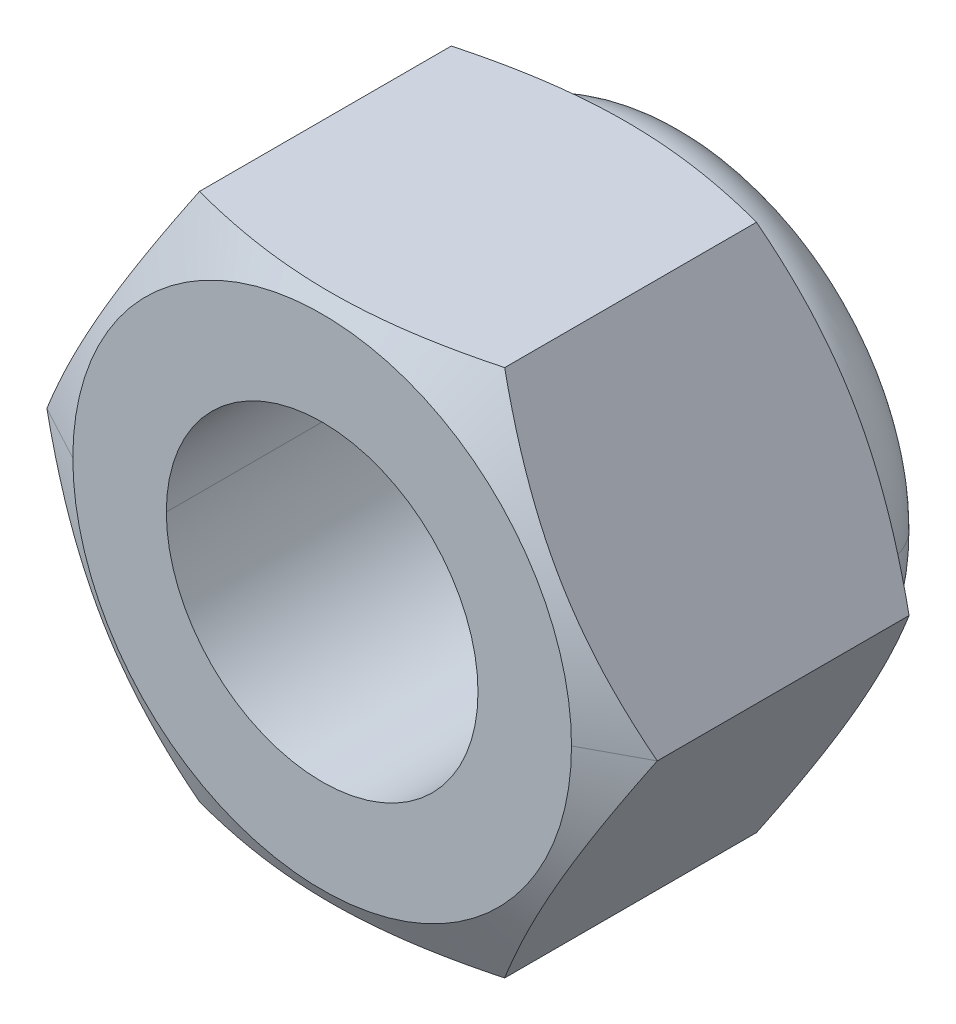
ISO-10303-21;
HEADER;
FILE_DESCRIPTION(('STEP AP214'),'2;1');
FILE_NAME('part.step','',(''),(''),'','','');
FILE_SCHEMA(('AUTOMOTIVE_DESIGN { 1 0 10303 214 1 1 1 1 }'));
ENDSEC;
DATA;
#1=APPLICATION_CONTEXT('core data for automotive mechanical design processes');
#2=APPLICATION_PROTOCOL_DEFINITION('international standard','automotive_design',2000,#1);
#3=PRODUCT_CONTEXT('',#1,'mechanical');
#4=PRODUCT('Part','Part','',(#3));
#5=PRODUCT_RELATED_PRODUCT_CATEGORY('part','',(#4));
#6=PRODUCT_DEFINITION_FORMATION('','',#4);
#7=PRODUCT_DEFINITION_CONTEXT('part definition',#1,'design');
#8=PRODUCT_DEFINITION('design','',#6,#7);
#9=PRODUCT_DEFINITION_SHAPE('','',#8);
#10=(LENGTH_UNIT() NAMED_UNIT(*) SI_UNIT(.MILLI.,.METRE.));
#11=(NAMED_UNIT(*) PLANE_ANGLE_UNIT() SI_UNIT($,.RADIAN.));
#12=(NAMED_UNIT(*) SI_UNIT($,.STERADIAN.) SOLID_ANGLE_UNIT());
#13=UNCERTAINTY_MEASURE_WITH_UNIT(LENGTH_MEASURE(1.E-05),#10,'distance_accuracy_value','');
#14=(GEOMETRIC_REPRESENTATION_CONTEXT(3) GLOBAL_UNCERTAINTY_ASSIGNED_CONTEXT((#13)) GLOBAL_UNIT_ASSIGNED_CONTEXT((#10,
#11,#12)) REPRESENTATION_CONTEXT('',''));
#15=CARTESIAN_POINT('',(0.,0.,0.));
#16=DIRECTION('',(0.,0.,1.));
#17=DIRECTION('',(1.,0.,0.));
#18=AXIS2_PLACEMENT_3D('',#15,#16,#17);
#19=CARTESIAN_POINT('',(0.,0.,-3.81));
#20=DIRECTION('',(0.,0.,1.));
#21=DIRECTION('',(-1.,0.,0.));
#22=AXIS2_PLACEMENT_3D('',#19,#20,#21);
#23=CYLINDRICAL_SURFACE('',#22,1.5875);
#24=DIRECTION('',(0.,0.,1.));
#25=VECTOR('',#24,1.);
#26=CARTESIAN_POINT('',(1.5875,0.,-3.81));
#27=LINE('',#26,#25);
#28=CARTESIAN_POINT('',(1.5875,0.,-3.81));
#29=VERTEX_POINT('',#28);
#30=CARTESIAN_POINT('',(1.5875,0.,0.));
#31=VERTEX_POINT('',#30);
#32=EDGE_CURVE('E177',#29,#31,#27,.T.);
#33=ORIENTED_EDGE('',*,*,#32,.T.);
#34=CARTESIAN_POINT('',(0.,0.,0.));
#35=DIRECTION('',(0.,0.,-1.));
#36=DIRECTION('',(-1.,0.,0.));
#37=AXIS2_PLACEMENT_3D('',#34,#35,#36);
#38=CIRCLE('',#37,1.5875);
#39=CARTESIAN_POINT('',(-1.5875,0.,0.));
#40=VERTEX_POINT('',#39);
#41=EDGE_CURVE('E11',#40,#31,#38,.T.);
#42=ORIENTED_EDGE('',*,*,#41,.F.);
#43=DIRECTION('',(0.,0.,1.));
#44=VECTOR('',#43,1.);
#45=CARTESIAN_POINT('',(-1.5875,0.,-3.81));
#46=LINE('',#45,#44);
#47=CARTESIAN_POINT('',(-1.5875,0.,-3.81));
#48=VERTEX_POINT('',#47);
#49=EDGE_CURVE('E182',#48,#40,#46,.T.);
#50=ORIENTED_EDGE('',*,*,#49,.F.);
#51=CARTESIAN_POINT('',(0.,0.,-3.81));
#52=DIRECTION('',(0.,0.,-1.));
#53=DIRECTION('',(-1.,0.,0.));
#54=AXIS2_PLACEMENT_3D('',#51,#52,#53);
#55=CIRCLE('',#54,1.5875);
#56=EDGE_CURVE('E171',#48,#29,#55,.T.);
#57=ORIENTED_EDGE('',*,*,#56,.T.);
#58=EDGE_LOOP('',(#33,#42,#50,#57));
#59=FACE_BOUND('',#58,.T.);
#60=ADVANCED_FACE('F51',(#59),#23,.F.);
#61=CARTESIAN_POINT('',(3.10891572953226,0.,0.));
#62=DIRECTION('',(0.,0.,-1.));
#63=DIRECTION('',(0.,-1.,0.));
#64=AXIS2_PLACEMENT_3D('',#61,#62,#63);
#65=PLANE('',#64);
#66=ORIENTED_EDGE('',*,*,#41,.T.);
#67=CARTESIAN_POINT('',(0.,0.,0.));
#68=DIRECTION('',(0.,0.,-1.));
#69=DIRECTION('',(-1.,0.,0.));
#70=AXIS2_PLACEMENT_3D('',#67,#68,#69);
#71=CIRCLE('',#70,1.5875);
#72=EDGE_CURVE('E187',#31,#40,#71,.T.);
#73=ORIENTED_EDGE('',*,*,#72,.T.);
#74=EDGE_LOOP('',(#66,#73));
#75=FACE_BOUND('',#74,.T.);
#76=CARTESIAN_POINT('',(0.,0.,0.));
#77=DIRECTION('',(0.,0.,1.));
#78=DIRECTION('',(1.,0.,0.));
#79=AXIS2_PLACEMENT_3D('',#76,#77,#78);
#80=CIRCLE('',#79,2.54);
#81=CARTESIAN_POINT('',(2.54,0.,0.));
#82=VERTEX_POINT('',#81);
#83=CARTESIAN_POINT('',(-2.54,0.,0.));
#84=VERTEX_POINT('',#83);
#85=EDGE_CURVE('E196',#82,#84,#80,.T.);
#86=ORIENTED_EDGE('',*,*,#85,.T.);
#87=CARTESIAN_POINT('',(0.,0.,0.));
#88=DIRECTION('',(0.,0.,1.));
#89=DIRECTION('',(1.,0.,0.));
#90=AXIS2_PLACEMENT_3D('',#87,#88,#89);
#91=CIRCLE('',#90,2.54);
#92=EDGE_CURVE('E63',#84,#82,#91,.T.);
#93=ORIENTED_EDGE('',*,*,#92,.T.);
#94=EDGE_LOOP('',(#86,#93));
#95=FACE_BOUND('',#94,.T.);
#96=ADVANCED_FACE('F53',(#75,#95),#65,.F.);
#97=CARTESIAN_POINT('',(0.,0.,-0.304799999999995));
#98=DIRECTION('',(0.,0.,-1.));
#99=DIRECTION('',(1.,0.,0.));
#100=AXIS2_PLACEMENT_3D('',#97,#98,#99);
#101=CONICAL_SURFACE('',#100,3.10891572953229,1.07895476037298);
#102=DIRECTION('',(-0.88146467411026,0.,-0.472249963785803));
#103=VECTOR('',#102,1.);
#104=CARTESIAN_POINT('',(-3.1089157295323,0.,-0.3048));
#105=LINE('',#104,#103);
#106=CARTESIAN_POINT('',(-3.1089157295323,0.,-0.304800000000011));
#107=VERTEX_POINT('',#106);
#108=EDGE_CURVE('E200',#84,#107,#105,.T.);
#109=ORIENTED_EDGE('',*,*,#108,.T.);
#110=CARTESIAN_POINT('',(-1.55445786476616,-2.69239999999998,-0.304800000000005));
#111=CARTESIAN_POINT('',(-1.970517509489,-1.97176355636096,-0.0818935603825836));
#112=CARTESIAN_POINT('',(-2.33056600282953,-1.34814127270653,-0.0816497101534322));
#113=CARTESIAN_POINT('',(-2.52335118939799,-1.01422753462332,-0.0815191424304966));
#114=CARTESIAN_POINT('',(-2.7236107758482,-0.667367756188819,-0.141536959324231));
#115=CARTESIAN_POINT('',(-2.90647590845132,-0.35063605558739,-0.196341656764031));
#116=CARTESIAN_POINT('',(-3.10891572953228,0.,-0.3048));
#117=B_SPLINE_CURVE_WITH_KNOTS('',2,(#110,#111,#112,#113,#114,#115,#116),.UNSPECIFIED.,.F.,.F.,
(3,2,2,3),(0.,0.5,0.75,1.),.UNSPECIFIED.);
#118=CARTESIAN_POINT('',(-1.55445786476615,-2.6924,-0.304800000000004));
#119=VERTEX_POINT('',#118);
#120=EDGE_CURVE('E544',#119,#107,#117,.T.);
#121=ORIENTED_EDGE('',*,*,#120,.F.);
#122=CARTESIAN_POINT('',(1.55445786476615,-2.6924,-0.3048));
#123=CARTESIAN_POINT('',(1.15149227233042,-2.6924,-0.196854388551155));
#124=CARTESIAN_POINT('',(0.78843677338761,-2.6924,-0.142226028969835));
#125=CARTESIAN_POINT('',(0.38619151243912,-2.6924,-0.0817008508112245));
#126=CARTESIAN_POINT('',(0.00122354164799519,-2.6924,-0.0816493591715298));
#127=CARTESIAN_POINT('',(-0.382921452950705,-2.6924,-0.0815979776095403));
#128=CARTESIAN_POINT('',(-0.781839178250109,-2.6924,-0.141236482160184));
#129=CARTESIAN_POINT('',(-1.14849772197348,-2.6924,-0.196052214431705));
#130=CARTESIAN_POINT('',(-1.55445786476616,-2.6924,-0.3048));
#131=B_SPLINE_CURVE_WITH_KNOTS('',2,(#122,#123,#124,#125,#126,#127,#128,#129,#130),
.UNSPECIFIED.,.F.,.F.,(3,2,2,2,3),(0.,0.25,0.5,0.75,1.),.UNSPECIFIED.);
#132=CARTESIAN_POINT('',(1.55445786476615,-2.6924,-0.304800000000005));
#133=VERTEX_POINT('',#132);
#134=EDGE_CURVE('E508',#133,#119,#131,.T.);
#135=ORIENTED_EDGE('',*,*,#134,.F.);
#136=CARTESIAN_POINT('',(3.10891572953231,0.,-0.3048));
#137=CARTESIAN_POINT('',(2.69285608480941,-0.720636443639103,-0.0818935603825949));
#138=CARTESIAN_POINT('',(2.3328075914689,-1.3442587272935,-0.0816497101534448));
#139=CARTESIAN_POINT('',(2.14002240490006,-1.67817246537738,-0.0815191424305096));
#140=CARTESIAN_POINT('',(1.93976281845023,-2.0250322438112,-0.14153695932425));
#141=CARTESIAN_POINT('',(1.75689768584673,-2.34176394441329,-0.19634165676427));
#142=CARTESIAN_POINT('',(1.55445786476616,-2.69239999999999,-0.3048));
#143=B_SPLINE_CURVE_WITH_KNOTS('',2,(#136,#137,#138,#139,#140,#141,#142),.UNSPECIFIED.,.F.,.F.,
(3,2,2,3),(0.,0.5,0.75,1.),.UNSPECIFIED.);
#144=CARTESIAN_POINT('',(3.1089157295323,0.,-0.304799999999987));
#145=VERTEX_POINT('',#144);
#146=EDGE_CURVE('E505',#145,#133,#143,.T.);
#147=ORIENTED_EDGE('',*,*,#146,.F.);
#148=DIRECTION('',(0.881464674110261,0.,-0.472249963785803));
#149=VECTOR('',#148,1.);
#150=CARTESIAN_POINT('',(3.10891572953229,0.,-0.304799999999993));
#151=LINE('',#150,#149);
#152=EDGE_CURVE('E210',#82,#145,#151,.T.);
#153=ORIENTED_EDGE('',*,*,#152,.F.);
#154=ORIENTED_EDGE('',*,*,#92,.F.);
#155=EDGE_LOOP('',(#109,#121,#135,#147,#153,#154));
#156=FACE_BOUND('',#155,.T.);
#157=ADVANCED_FACE('F249',(#156),#101,.T.);
#158=CARTESIAN_POINT('',(0.,0.,-3.175));
#159=DIRECTION('',(0.,0.,-1.));
#160=DIRECTION('',(1.,0.,0.));
#161=AXIS2_PLACEMENT_3D('',#158,#159,#160);
#162=TOROIDAL_SURFACE('',#161,1.905,0.635);
#163=CARTESIAN_POINT('',(-1.905,0.,-3.175));
#164=DIRECTION('',(0.,-1.,0.));
#165=DIRECTION('',(-1.,0.,0.));
#166=AXIS2_PLACEMENT_3D('',#163,#164,#165);
#167=CIRCLE('',#166,0.635);
#168=CARTESIAN_POINT('',(-2.54,0.,-3.175));
#169=VERTEX_POINT('',#168);
#170=CARTESIAN_POINT('',(-1.905,0.,-3.81));
#171=VERTEX_POINT('',#170);
#172=EDGE_CURVE('E209',#169,#171,#167,.T.);
#173=ORIENTED_EDGE('',*,*,#172,.T.);
#174=CARTESIAN_POINT('',(0.,0.,-3.81));
#175=DIRECTION('',(0.,0.,1.));
#176=DIRECTION('',(1.,0.,0.));
#177=AXIS2_PLACEMENT_3D('',#174,#175,#176);
#178=CIRCLE('',#177,1.905);
#179=CARTESIAN_POINT('',(1.905,0.,-3.81));
#180=VERTEX_POINT('',#179);
#181=EDGE_CURVE('E184',#171,#180,#178,.T.);
#182=ORIENTED_EDGE('',*,*,#181,.T.);
#183=CARTESIAN_POINT('',(1.905,0.,-3.175));
#184=DIRECTION('',(0.,1.,0.));
#185=DIRECTION('',(1.,0.,0.));
#186=AXIS2_PLACEMENT_3D('',#183,#184,#185);
#187=CIRCLE('',#186,0.635);
#188=CARTESIAN_POINT('',(2.54,0.,-3.175));
#189=VERTEX_POINT('',#188);
#190=EDGE_CURVE('E217',#189,#180,#187,.T.);
#191=ORIENTED_EDGE('',*,*,#190,.F.);
#192=CARTESIAN_POINT('',(0.,0.,-3.175));
#193=DIRECTION('',(0.,0.,1.));
#194=DIRECTION('',(1.,0.,0.));
#195=AXIS2_PLACEMENT_3D('',#192,#193,#194);
#196=CIRCLE('',#195,2.54);
#197=EDGE_CURVE('E201',#169,#189,#196,.T.);
#198=ORIENTED_EDGE('',*,*,#197,.F.);
#199=EDGE_LOOP('',(#173,#182,#191,#198));
#200=FACE_BOUND('',#199,.T.);
#201=ADVANCED_FACE('F740',(#200),#162,.T.);
#202=CARTESIAN_POINT('',(0.,0.,-3.81));
#203=DIRECTION('',(0.,0.,-1.));
#204=DIRECTION('',(0.,-1.,0.));
#205=AXIS2_PLACEMENT_3D('',#202,#203,#204);
#206=PLANE('',#205);
#207=ORIENTED_EDGE('',*,*,#56,.F.);
#208=CARTESIAN_POINT('',(0.,0.,-3.81));
#209=DIRECTION('',(0.,0.,-1.));
#210=DIRECTION('',(-1.,0.,0.));
#211=AXIS2_PLACEMENT_3D('',#208,#209,#210);
#212=CIRCLE('',#211,1.5875);
#213=EDGE_CURVE('E167',#29,#48,#212,.T.);
#214=ORIENTED_EDGE('',*,*,#213,.F.);
#215=EDGE_LOOP('',(#207,#214));
#216=FACE_BOUND('',#215,.T.);
#217=CARTESIAN_POINT('',(0.,0.,-3.81));
#218=DIRECTION('',(0.,0.,1.));
#219=DIRECTION('',(1.,0.,0.));
#220=AXIS2_PLACEMENT_3D('',#217,#218,#219);
#221=CIRCLE('',#220,1.905);
#222=EDGE_CURVE('E214',#180,#171,#221,.T.);
#223=ORIENTED_EDGE('',*,*,#222,.F.);
#224=ORIENTED_EDGE('',*,*,#181,.F.);
#225=EDGE_LOOP('',(#223,#224));
#226=FACE_BOUND('',#225,.T.);
#227=ADVANCED_FACE('F169',(#216,#226),#206,.T.);
#228=CARTESIAN_POINT('',(0.,0.,-3.175));
#229=DIRECTION('',(0.,0.,1.));
#230=DIRECTION('',(-1.,0.,0.));
#231=AXIS2_PLACEMENT_3D('',#228,#229,#230);
#232=CONICAL_SURFACE('',#231,2.54,1.07895476037297);
#233=DIRECTION('',(0.881464674110254,0.,0.472249963785816));
#234=VECTOR('',#233,1.);
#235=CARTESIAN_POINT('',(2.54,0.,-3.175));
#236=LINE('',#235,#234);
#237=CARTESIAN_POINT('',(3.1089157295323,0.,-2.8702));
#238=VERTEX_POINT('',#237);
#239=EDGE_CURVE('E221',#189,#238,#236,.T.);
#240=ORIENTED_EDGE('',*,*,#239,.T.);
#241=CARTESIAN_POINT('',(1.55445786476615,-2.6924,-2.87019999999999));
#242=CARTESIAN_POINT('',(1.97051750948899,-1.971763556361,-3.09310643961742));
#243=CARTESIAN_POINT('',(2.33056600282954,-1.34814127270653,-3.09335028984657));
#244=CARTESIAN_POINT('',(2.5233511893982,-1.01422753462298,-3.09348085756951));
#245=CARTESIAN_POINT('',(2.72361077584821,-0.667367756188818,-3.03346304067576));
#246=CARTESIAN_POINT('',(2.90647590845147,-0.350636055587147,-2.97865834323587));
#247=CARTESIAN_POINT('',(3.1089157295323,0.,-2.87020000000001));
#248=B_SPLINE_CURVE_WITH_KNOTS('',2,(#241,#242,#243,#244,#245,#246,#247),.UNSPECIFIED.,.F.,.F.,
(3,2,2,3),(0.,0.5,0.75,1.),.UNSPECIFIED.);
#249=CARTESIAN_POINT('',(1.55445786476616,-2.6924,-2.8702));
#250=VERTEX_POINT('',#249);
#251=EDGE_CURVE('E312',#250,#238,#248,.T.);
#252=ORIENTED_EDGE('',*,*,#251,.F.);
#253=CARTESIAN_POINT('',(-1.55445786476615,-2.6924,-2.8702));
#254=CARTESIAN_POINT('',(-1.14790429538221,-2.6924,-2.97910675148861));
#255=CARTESIAN_POINT('',(-0.781839178250103,-2.6924,-3.03376351783985));
#256=CARTESIAN_POINT('',(-0.381840176943145,-2.6924,-3.09348691384776));
#257=CARTESIAN_POINT('',(0.00122354164800516,-2.6924,-3.09335064082851));
#258=CARTESIAN_POINT('',(0.38727429425648,-2.6924,-3.09321330518671));
#259=CARTESIAN_POINT('',(0.78843677338763,-2.6924,-3.0327739710302));
#260=CARTESIAN_POINT('',(1.15208739176097,-2.6924,-2.97798619205423));
#261=CARTESIAN_POINT('',(1.55445786476616,-2.6924,-2.8702));
#262=B_SPLINE_CURVE_WITH_KNOTS('',2,(#253,#254,#255,#256,#257,#258,#259,#260,#261),
.UNSPECIFIED.,.F.,.F.,(3,2,2,2,3),(0.,0.25,0.5,0.75,1.),.UNSPECIFIED.);
#263=CARTESIAN_POINT('',(-1.55445786476614,-2.69240000000004,-2.8702));
#264=VERTEX_POINT('',#263);
#265=EDGE_CURVE('E205',#264,#250,#262,.T.);
#266=ORIENTED_EDGE('',*,*,#265,.F.);
#267=CARTESIAN_POINT('',(-3.10891572953228,0.,-2.87020000000001));
#268=CARTESIAN_POINT('',(-2.6928560848094,-0.720636443639101,-3.09310643961743));
#269=CARTESIAN_POINT('',(-2.33280759146888,-1.34425872729351,-3.09335028984658));
#270=CARTESIAN_POINT('',(-2.14002240489924,-1.67817246537877,-3.09348085756952));
#271=CARTESIAN_POINT('',(-1.93976281845021,-2.02503224381122,-3.03346304067578));
#272=CARTESIAN_POINT('',(-1.75689768584576,-2.34176394441495,-2.97865834323525));
#273=CARTESIAN_POINT('',(-1.55445786476613,-2.69240000000003,-2.8702));
#274=B_SPLINE_CURVE_WITH_KNOTS('',2,(#267,#268,#269,#270,#271,#272,#273),.UNSPECIFIED.,.F.,.F.,
(3,2,2,3),(0.,0.5,0.75,1.),.UNSPECIFIED.);
#275=CARTESIAN_POINT('',(-3.1089157295323,0.,-2.8702));
#276=VERTEX_POINT('',#275);
#277=EDGE_CURVE('E271',#276,#264,#274,.T.);
#278=ORIENTED_EDGE('',*,*,#277,.F.);
#279=DIRECTION('',(-0.881464674110254,0.,0.472249963785815));
#280=VECTOR('',#279,1.);
#281=CARTESIAN_POINT('',(-2.54,0.,-3.175));
#282=LINE('',#281,#280);
#283=EDGE_CURVE('E511',#169,#276,#282,.T.);
#284=ORIENTED_EDGE('',*,*,#283,.F.);
#285=ORIENTED_EDGE('',*,*,#197,.T.);
#286=EDGE_LOOP('',(#240,#252,#266,#278,#284,#285));
#287=FACE_BOUND('',#286,.T.);
#288=ADVANCED_FACE('F238',(#287),#232,.T.);
#289=CARTESIAN_POINT('',(-1.55445786476615,-2.6924,-3.175));
#290=DIRECTION('',(0.,1.,0.));
#291=DIRECTION('',(0.,0.,1.));
#292=AXIS2_PLACEMENT_3D('',#289,#290,#291);
#293=PLANE('',#292);
#294=ORIENTED_EDGE('',*,*,#134,.T.);
#295=DIRECTION('',(0.,0.,1.));
#296=VECTOR('',#295,1.);
#297=CARTESIAN_POINT('',(-1.55445786476615,-2.6924,-3.175));
#298=LINE('',#297,#296);
#299=EDGE_CURVE('E76',#264,#119,#298,.T.);
#300=ORIENTED_EDGE('',*,*,#299,.F.);
#301=ORIENTED_EDGE('',*,*,#265,.T.);
#302=DIRECTION('',(0.,0.,1.));
#303=VECTOR('',#302,1.);
#304=CARTESIAN_POINT('',(1.55445786476615,-2.6924,-3.175));
#305=LINE('',#304,#303);
#306=EDGE_CURVE('E417',#250,#133,#305,.T.);
#307=ORIENTED_EDGE('',*,*,#306,.T.);
#308=EDGE_LOOP('',(#294,#300,#301,#307));
#309=FACE_BOUND('',#308,.T.);
#310=ADVANCED_FACE('F248',(#309),#293,.F.);
#311=CARTESIAN_POINT('',(-3.10891572953229,0.,-3.175));
#312=DIRECTION('',(0.866025403784439,0.5,0.));
#313=DIRECTION('',(0.,0.,1.));
#314=AXIS2_PLACEMENT_3D('',#311,#312,#313);
#315=PLANE('',#314);
#316=ORIENTED_EDGE('',*,*,#120,.T.);
#317=DIRECTION('',(0.,0.,1.));
#318=VECTOR('',#317,1.);
#319=CARTESIAN_POINT('',(-3.10891572953229,0.,-3.175));
#320=LINE('',#319,#318);
#321=EDGE_CURVE('E276',#276,#107,#320,.T.);
#322=ORIENTED_EDGE('',*,*,#321,.F.);
#323=ORIENTED_EDGE('',*,*,#277,.T.);
#324=ORIENTED_EDGE('',*,*,#299,.T.);
#325=EDGE_LOOP('',(#316,#322,#323,#324));
#326=FACE_BOUND('',#325,.T.);
#327=ADVANCED_FACE('F278',(#326),#315,.F.);
#328=CARTESIAN_POINT('',(-1.55445786476615,2.6924,-3.175));
#329=DIRECTION('',(0.866025403784439,-0.5,0.));
#330=DIRECTION('',(0.,0.,1.));
#331=AXIS2_PLACEMENT_3D('',#328,#329,#330);
#332=PLANE('',#331);
#333=CARTESIAN_POINT('',(-3.1089157295323,0.,-0.3048));
#334=CARTESIAN_POINT('',(-2.69285608480944,0.720636443639046,-0.081893560382575));
#335=CARTESIAN_POINT('',(-2.33280759146888,1.34425872729352,-0.0816497101534196));
#336=CARTESIAN_POINT('',(-2.1400224049007,1.67817246537625,-0.0815191424304849));
#337=CARTESIAN_POINT('',(-1.93976281845021,2.02503224381123,-0.141536959324225));
#338=CARTESIAN_POINT('',(-1.75689768584744,2.34176394441205,-0.19634165676385));
#339=CARTESIAN_POINT('',(-1.55445786476614,2.69240000000002,-0.3048));
#340=B_SPLINE_CURVE_WITH_KNOTS('',2,(#333,#334,#335,#336,#337,#338,#339),.UNSPECIFIED.,.F.,.F.,
(3,2,2,3),(0.,0.5,0.75,1.),.UNSPECIFIED.);
#341=CARTESIAN_POINT('',(-1.55445786476615,2.6924,-0.3048));
#342=VERTEX_POINT('',#341);
#343=EDGE_CURVE('E307',#107,#342,#340,.T.);
#344=ORIENTED_EDGE('',*,*,#343,.T.);
#345=DIRECTION('',(0.,0.,1.));
#346=VECTOR('',#345,1.);
#347=CARTESIAN_POINT('',(-1.55445786476615,2.6924,-3.175));
#348=LINE('',#347,#346);
#349=CARTESIAN_POINT('',(-1.55445786476615,2.6924,-2.8702));
#350=VERTEX_POINT('',#349);
#351=EDGE_CURVE('E381',#350,#342,#348,.T.);
#352=ORIENTED_EDGE('',*,*,#351,.F.);
#353=CARTESIAN_POINT('',(-1.55445786476615,2.6924,-2.8702));
#354=CARTESIAN_POINT('',(-1.97051750948903,1.97176355636091,-3.09310643961741));
#355=CARTESIAN_POINT('',(-2.33056600282956,1.34814127270649,-3.09335028984656));
#356=CARTESIAN_POINT('',(-2.52335118939835,1.0142275346227,-3.09348085756949));
#357=CARTESIAN_POINT('',(-2.72361077584822,0.667367756188788,-3.03346304067575));
#358=CARTESIAN_POINT('',(-2.90647590845163,0.350636055586866,-2.97865834323577));
#359=CARTESIAN_POINT('',(-3.1089157295323,0.,-2.87020000000001));
#360=B_SPLINE_CURVE_WITH_KNOTS('',2,(#353,#354,#355,#356,#357,#358,#359),.UNSPECIFIED.,.F.,.F.,
(3,2,2,3),(0.,0.5,0.75,1.),.UNSPECIFIED.);
#361=EDGE_CURVE('E365',#350,#276,#360,.T.);
#362=ORIENTED_EDGE('',*,*,#361,.T.);
#363=ORIENTED_EDGE('',*,*,#321,.T.);
#364=EDGE_LOOP('',(#344,#352,#362,#363));
#365=FACE_BOUND('',#364,.T.);
#366=ADVANCED_FACE('F287',(#365),#332,.F.);
#367=CARTESIAN_POINT('',(1.55445786476613,2.6924,-3.175));
#368=DIRECTION('',(0.,-1.,0.));
#369=DIRECTION('',(0.,0.,1.));
#370=AXIS2_PLACEMENT_3D('',#367,#368,#369);
#371=PLANE('',#370);
#372=CARTESIAN_POINT('',(-1.55445786476615,2.6924,-0.3048));
#373=CARTESIAN_POINT('',(-1.14790429538488,2.6924,-0.1958932485121));
#374=CARTESIAN_POINT('',(-0.78183917825011,2.6924,-0.141236482160155));
#375=CARTESIAN_POINT('',(-0.38184017694542,2.6924,-0.0815130861522447));
#376=CARTESIAN_POINT('',(0.00122354164799497,2.6924,-0.0816493591714999));
#377=CARTESIAN_POINT('',(0.387274294256555,2.6924,-0.0817866948132949));
#378=CARTESIAN_POINT('',(0.78843677338761,2.6924,-0.142226028969805));
#379=CARTESIAN_POINT('',(1.15208739176104,2.6924,-0.1970138079458));
#380=CARTESIAN_POINT('',(1.55445786476615,2.6924,-0.3048));
#381=B_SPLINE_CURVE_WITH_KNOTS('',2,(#372,#373,#374,#375,#376,#377,#378,#379,#380),
.UNSPECIFIED.,.F.,.F.,(3,2,2,2,3),(0.,0.25,0.5,0.75,1.),.UNSPECIFIED.);
#382=CARTESIAN_POINT('',(1.55445786476614,2.6924,-0.304799999999997));
#383=VERTEX_POINT('',#382);
#384=EDGE_CURVE('E474',#342,#383,#381,.T.);
#385=ORIENTED_EDGE('',*,*,#384,.T.);
#386=DIRECTION('',(0.,0.,1.));
#387=VECTOR('',#386,1.);
#388=CARTESIAN_POINT('',(1.55445786476613,2.6924,-3.175));
#389=LINE('',#388,#387);
#390=CARTESIAN_POINT('',(1.55445786476614,2.6924,-2.8702));
#391=VERTEX_POINT('',#390);
#392=EDGE_CURVE('E390',#391,#383,#389,.T.);
#393=ORIENTED_EDGE('',*,*,#392,.F.);
#394=CARTESIAN_POINT('',(1.55445786476614,2.6924,-2.8702));
#395=CARTESIAN_POINT('',(1.15149227233174,2.6924,-2.97814561144849));
#396=CARTESIAN_POINT('',(0.788436773387597,2.6924,-3.03277397103017));
#397=CARTESIAN_POINT('',(0.386191512439247,2.6924,-3.09329914918893));
#398=CARTESIAN_POINT('',(0.00122354164798998,2.6924,-3.09335064082848));
#399=CARTESIAN_POINT('',(-0.382921452952905,2.6924,-3.09340202239031));
#400=CARTESIAN_POINT('',(-0.78183917825011,2.6924,-3.03376351783982));
#401=CARTESIAN_POINT('',(-1.1484977219748,2.6924,-2.97894778556793));
#402=CARTESIAN_POINT('',(-1.55445786476615,2.6924,-2.8702));
#403=B_SPLINE_CURVE_WITH_KNOTS('',2,(#394,#395,#396,#397,#398,#399,#400,#401,#402),
.UNSPECIFIED.,.F.,.F.,(3,2,2,2,3),(0.,0.25,0.5,0.75,1.),.UNSPECIFIED.);
#404=EDGE_CURVE('E394',#391,#350,#403,.T.);
#405=ORIENTED_EDGE('',*,*,#404,.T.);
#406=ORIENTED_EDGE('',*,*,#351,.T.);
#407=EDGE_LOOP('',(#385,#393,#405,#406));
#408=FACE_BOUND('',#407,.T.);
#409=ADVANCED_FACE('F252',(#408),#371,.F.);
#410=CARTESIAN_POINT('',(3.10891572953229,0.,-3.175));
#411=DIRECTION('',(-0.866025403784439,-0.5,0.));
#412=DIRECTION('',(-0.5,0.866025403784439,0.));
#413=AXIS2_PLACEMENT_3D('',#410,#411,#412);
#414=PLANE('',#413);
#415=CARTESIAN_POINT('',(1.55445786476612,2.69239999999999,-0.304799999999999));
#416=CARTESIAN_POINT('',(1.97051750948896,1.97176355636097,-0.0818935603825585));
#417=CARTESIAN_POINT('',(2.33056600282952,1.34814127270651,-0.0816497101534083));
#418=CARTESIAN_POINT('',(2.52335118939827,1.01422753462277,-0.0815191424304736));
#419=CARTESIAN_POINT('',(2.72361077584819,0.66736775618879,-0.141536959324218));
#420=CARTESIAN_POINT('',(2.9064759084516,0.350636055586862,-0.196341656764189));
#421=CARTESIAN_POINT('',(3.10891572953227,0.,-0.304799999999999));
#422=B_SPLINE_CURVE_WITH_KNOTS('',2,(#415,#416,#417,#418,#419,#420,#421),.UNSPECIFIED.,.F.,.F.,
(3,2,2,3),(0.,0.5,0.75,1.),.UNSPECIFIED.);
#423=EDGE_CURVE('E357',#383,#145,#422,.T.);
#424=ORIENTED_EDGE('',*,*,#423,.T.);
#425=DIRECTION('',(0.,0.,1.));
#426=VECTOR('',#425,1.);
#427=CARTESIAN_POINT('',(3.10891572953229,0.,-3.175));
#428=LINE('',#427,#426);
#429=EDGE_CURVE('E327',#238,#145,#428,.T.);
#430=ORIENTED_EDGE('',*,*,#429,.F.);
#431=CARTESIAN_POINT('',(3.10891572953229,0.,-2.8702));
#432=CARTESIAN_POINT('',(2.69285608480887,0.72063644363998,-3.09310643961772));
#433=CARTESIAN_POINT('',(2.33280759146887,1.34425872729348,-3.09335028984657));
#434=CARTESIAN_POINT('',(2.14002240489952,1.67817246537825,-3.09348085756935));
#435=CARTESIAN_POINT('',(1.93976281845021,2.02503224381118,-3.03346304067576));
#436=CARTESIAN_POINT('',(1.75689768584669,2.34176394441329,-2.97865834323573));
#437=CARTESIAN_POINT('',(1.55445786476613,2.69239999999997,-2.8702));
#438=B_SPLINE_CURVE_WITH_KNOTS('',2,(#431,#432,#433,#434,#435,#436,#437),.UNSPECIFIED.,.F.,.F.,
(3,2,2,3),(0.,0.5,0.75,1.),.UNSPECIFIED.);
#439=EDGE_CURVE('E422',#238,#391,#438,.T.);
#440=ORIENTED_EDGE('',*,*,#439,.T.);
#441=ORIENTED_EDGE('',*,*,#392,.T.);
#442=EDGE_LOOP('',(#424,#430,#440,#441));
#443=FACE_BOUND('',#442,.T.);
#444=ADVANCED_FACE('F338',(#443),#414,.F.);
#445=CARTESIAN_POINT('',(1.55445786476615,-2.6924,-3.175));
#446=DIRECTION('',(-0.866025403784439,0.5,0.));
#447=DIRECTION('',(0.,0.,-1.));
#448=AXIS2_PLACEMENT_3D('',#445,#446,#447);
#449=PLANE('',#448);
#450=ORIENTED_EDGE('',*,*,#146,.T.);
#451=ORIENTED_EDGE('',*,*,#306,.F.);
#452=ORIENTED_EDGE('',*,*,#251,.T.);
#453=ORIENTED_EDGE('',*,*,#429,.T.);
#454=EDGE_LOOP('',(#450,#451,#452,#453));
#455=FACE_BOUND('',#454,.T.);
#456=ADVANCED_FACE('F329',(#455),#449,.F.);
#457=CARTESIAN_POINT('',(0.,0.,-3.175));
#458=DIRECTION('',(0.,0.,1.));
#459=DIRECTION('',(-1.,0.,0.));
#460=AXIS2_PLACEMENT_3D('',#457,#458,#459);
#461=CONICAL_SURFACE('',#460,2.54,1.07895476037297);
#462=CARTESIAN_POINT('',(0.,0.,-3.175));
#463=DIRECTION('',(0.,0.,1.));
#464=DIRECTION('',(1.,0.,0.));
#465=AXIS2_PLACEMENT_3D('',#462,#463,#464);
#466=CIRCLE('',#465,2.54);
#467=EDGE_CURVE('E206',#189,#169,#466,.T.);
#468=ORIENTED_EDGE('',*,*,#467,.T.);
#469=ORIENTED_EDGE('',*,*,#283,.T.);
#470=ORIENTED_EDGE('',*,*,#361,.F.);
#471=ORIENTED_EDGE('',*,*,#404,.F.);
#472=ORIENTED_EDGE('',*,*,#439,.F.);
#473=ORIENTED_EDGE('',*,*,#239,.F.);
#474=EDGE_LOOP('',(#468,#469,#470,#471,#472,#473));
#475=FACE_BOUND('',#474,.T.);
#476=ADVANCED_FACE('F337',(#475),#461,.T.);
#477=CARTESIAN_POINT('',(0.,0.,-3.175));
#478=DIRECTION('',(0.,0.,-1.));
#479=DIRECTION('',(1.,0.,0.));
#480=AXIS2_PLACEMENT_3D('',#477,#478,#479);
#481=TOROIDAL_SURFACE('',#480,1.905,0.635);
#482=ORIENTED_EDGE('',*,*,#467,.F.);
#483=ORIENTED_EDGE('',*,*,#190,.T.);
#484=ORIENTED_EDGE('',*,*,#222,.T.);
#485=ORIENTED_EDGE('',*,*,#172,.F.);
#486=EDGE_LOOP('',(#482,#483,#484,#485));
#487=FACE_BOUND('',#486,.T.);
#488=ADVANCED_FACE('F288',(#487),#481,.T.);
#489=CARTESIAN_POINT('',(0.,0.,-0.304799999999995));
#490=DIRECTION('',(0.,0.,-1.));
#491=DIRECTION('',(1.,0.,0.));
#492=AXIS2_PLACEMENT_3D('',#489,#490,#491);
#493=CONICAL_SURFACE('',#492,3.10891572953229,1.07895476037298);
#494=ORIENTED_EDGE('',*,*,#85,.F.);
#495=ORIENTED_EDGE('',*,*,#152,.T.);
#496=ORIENTED_EDGE('',*,*,#423,.F.);
#497=ORIENTED_EDGE('',*,*,#384,.F.);
#498=ORIENTED_EDGE('',*,*,#343,.F.);
#499=ORIENTED_EDGE('',*,*,#108,.F.);
#500=EDGE_LOOP('',(#494,#495,#496,#497,#498,#499));
#501=FACE_BOUND('',#500,.T.);
#502=ADVANCED_FACE('F450',(#501),#493,.T.);
#503=CARTESIAN_POINT('',(0.,0.,-3.81));
#504=DIRECTION('',(0.,0.,1.));
#505=DIRECTION('',(-1.,0.,0.));
#506=AXIS2_PLACEMENT_3D('',#503,#504,#505);
#507=CYLINDRICAL_SURFACE('',#506,1.5875);
#508=ORIENTED_EDGE('',*,*,#213,.T.);
#509=ORIENTED_EDGE('',*,*,#49,.T.);
#510=ORIENTED_EDGE('',*,*,#72,.F.);
#511=ORIENTED_EDGE('',*,*,#32,.F.);
#512=EDGE_LOOP('',(#508,#509,#510,#511));
#513=FACE_BOUND('',#512,.T.);
#514=ADVANCED_FACE('F186',(#513),#507,.F.);
#515=CLOSED_SHELL('',(#60,#96,#157,#201,#227,#288,#310,#327,#366,#409,#444,#456,#476,#488,#502,#514));
#516=MANIFOLD_SOLID_BREP('B2',#515);
#517=ADVANCED_BREP_SHAPE_REPRESENTATION('',(#18,#516),#14);
#518=SHAPE_DEFINITION_REPRESENTATION(#9,#517);
ENDSEC;
END-ISO-10303-21;
